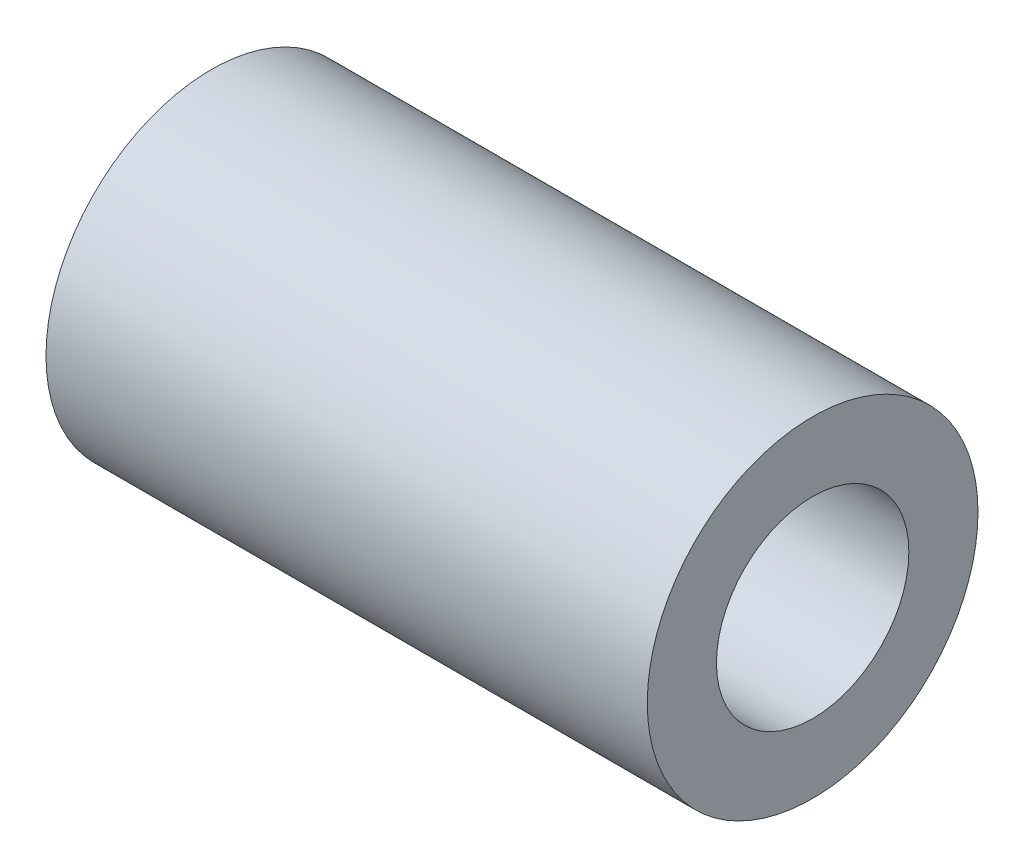
ISO-10303-21;
HEADER;
FILE_DESCRIPTION(('STEP AP214'),'2;1');
FILE_NAME('part.step','',(''),(''),'','','');
FILE_SCHEMA(('AUTOMOTIVE_DESIGN { 1 0 10303 214 1 1 1 1 }'));
ENDSEC;
DATA;
#1=APPLICATION_CONTEXT('core data for automotive mechanical design processes');
#2=APPLICATION_PROTOCOL_DEFINITION('international standard','automotive_design',2000,#1);
#3=PRODUCT_CONTEXT('',#1,'mechanical');
#4=PRODUCT('Part','Part','',(#3));
#5=PRODUCT_RELATED_PRODUCT_CATEGORY('part','',(#4));
#6=PRODUCT_DEFINITION_FORMATION('','',#4);
#7=PRODUCT_DEFINITION_CONTEXT('part definition',#1,'design');
#8=PRODUCT_DEFINITION('design','',#6,#7);
#9=PRODUCT_DEFINITION_SHAPE('','',#8);
#10=(LENGTH_UNIT() NAMED_UNIT(*) SI_UNIT(.MILLI.,.METRE.));
#11=(NAMED_UNIT(*) PLANE_ANGLE_UNIT() SI_UNIT($,.RADIAN.));
#12=(NAMED_UNIT(*) SI_UNIT($,.STERADIAN.) SOLID_ANGLE_UNIT());
#13=UNCERTAINTY_MEASURE_WITH_UNIT(LENGTH_MEASURE(1.E-05),#10,'distance_accuracy_value','');
#14=(GEOMETRIC_REPRESENTATION_CONTEXT(3) GLOBAL_UNCERTAINTY_ASSIGNED_CONTEXT((#13)) GLOBAL_UNIT_ASSIGNED_CONTEXT((#10,
#11,#12)) REPRESENTATION_CONTEXT('',''));
#15=CARTESIAN_POINT('',(0.,0.,0.));
#16=DIRECTION('',(0.,0.,1.));
#17=DIRECTION('',(1.,0.,0.));
#18=AXIS2_PLACEMENT_3D('',#15,#16,#17);
#19=CARTESIAN_POINT('',(-103.,5.5,0.));
#20=DIRECTION('',(1.,0.,0.));
#21=DIRECTION('',(0.,0.,-1.));
#22=AXIS2_PLACEMENT_3D('',#19,#20,#21);
#23=PLANE('',#22);
#24=CARTESIAN_POINT('',(-103.,0.,0.));
#25=DIRECTION('',(-1.,0.,0.));
#26=DIRECTION('',(0.,0.,1.));
#27=AXIS2_PLACEMENT_3D('',#24,#25,#26);
#28=CIRCLE('',#27,5.5);
#29=CARTESIAN_POINT('',(-103.,0.,5.5));
#30=VERTEX_POINT('',#29);
#31=EDGE_CURVE('E45',#30,#30,#28,.T.);
#32=ORIENTED_EDGE('',*,*,#31,.T.);
#33=EDGE_LOOP('',(#32));
#34=FACE_BOUND('',#33,.T.);
#35=ADVANCED_FACE('F31',(#34),#23,.F.);
#36=CARTESIAN_POINT('',(-94.,0.,0.));
#37=DIRECTION('',(-1.,0.,0.));
#38=DIRECTION('',(0.,0.,1.));
#39=AXIS2_PLACEMENT_3D('',#36,#37,#38);
#40=PLANE('',#39);
#41=CARTESIAN_POINT('',(-94.,0.,0.));
#42=DIRECTION('',(-1.,0.,0.));
#43=DIRECTION('',(0.,0.,1.));
#44=AXIS2_PLACEMENT_3D('',#41,#42,#43);
#45=CIRCLE('',#44,3.2);
#46=CARTESIAN_POINT('',(-94.,0.,3.2));
#47=VERTEX_POINT('',#46);
#48=EDGE_CURVE('E10',#47,#47,#45,.T.);
#49=ORIENTED_EDGE('',*,*,#48,.F.);
#50=EDGE_LOOP('',(#49));
#51=FACE_BOUND('',#50,.T.);
#52=ADVANCED_FACE('F65',(#51),#40,.F.);
#53=CARTESIAN_POINT('',(-110.,0.,0.));
#54=DIRECTION('',(-1.,0.,0.));
#55=DIRECTION('',(0.,0.,1.));
#56=AXIS2_PLACEMENT_3D('',#53,#54,#55);
#57=CYLINDRICAL_SURFACE('',#56,3.2);
#58=CARTESIAN_POINT('',(-83.,0.,0.));
#59=DIRECTION('',(-1.,0.,0.));
#60=DIRECTION('',(0.,0.,1.));
#61=AXIS2_PLACEMENT_3D('',#58,#59,#60);
#62=CIRCLE('',#61,3.2);
#63=CARTESIAN_POINT('',(-83.,0.,3.2));
#64=VERTEX_POINT('',#63);
#65=EDGE_CURVE('E37',#64,#64,#62,.T.);
#66=ORIENTED_EDGE('',*,*,#65,.F.);
#67=EDGE_LOOP('',(#66));
#68=FACE_BOUND('',#67,.T.);
#69=ORIENTED_EDGE('',*,*,#48,.T.);
#70=EDGE_LOOP('',(#69));
#71=FACE_BOUND('',#70,.T.);
#72=ADVANCED_FACE('F60',(#68,#71),#57,.F.);
#73=CARTESIAN_POINT('',(-83.,3.2,0.));
#74=DIRECTION('',(-1.,0.,0.));
#75=DIRECTION('',(0.,0.,1.));
#76=AXIS2_PLACEMENT_3D('',#73,#74,#75);
#77=PLANE('',#76);
#78=CARTESIAN_POINT('',(-83.,0.,0.));
#79=DIRECTION('',(-1.,0.,0.));
#80=DIRECTION('',(0.,0.,1.));
#81=AXIS2_PLACEMENT_3D('',#78,#79,#80);
#82=CIRCLE('',#81,5.5);
#83=CARTESIAN_POINT('',(-83.,0.,5.5));
#84=VERTEX_POINT('',#83);
#85=EDGE_CURVE('E41',#84,#84,#82,.T.);
#86=ORIENTED_EDGE('',*,*,#85,.F.);
#87=EDGE_LOOP('',(#86));
#88=FACE_BOUND('',#87,.T.);
#89=ORIENTED_EDGE('',*,*,#65,.T.);
#90=EDGE_LOOP('',(#89));
#91=FACE_BOUND('',#90,.T.);
#92=ADVANCED_FACE('F55',(#88,#91),#77,.F.);
#93=CARTESIAN_POINT('',(-110.,0.,0.));
#94=DIRECTION('',(-1.,0.,0.));
#95=DIRECTION('',(0.,0.,1.));
#96=AXIS2_PLACEMENT_3D('',#93,#94,#95);
#97=CYLINDRICAL_SURFACE('',#96,5.5);
#98=ORIENTED_EDGE('',*,*,#31,.F.);
#99=EDGE_LOOP('',(#98));
#100=FACE_BOUND('',#99,.T.);
#101=ORIENTED_EDGE('',*,*,#85,.T.);
#102=EDGE_LOOP('',(#101));
#103=FACE_BOUND('',#102,.T.);
#104=ADVANCED_FACE('F52',(#100,#103),#97,.T.);
#105=CLOSED_SHELL('',(#35,#52,#72,#92,#104));
#106=MANIFOLD_SOLID_BREP('B2',#105);
#107=ADVANCED_BREP_SHAPE_REPRESENTATION('',(#18,#106),#14);
#108=SHAPE_DEFINITION_REPRESENTATION(#9,#107);
ENDSEC;
END-ISO-10303-21;
